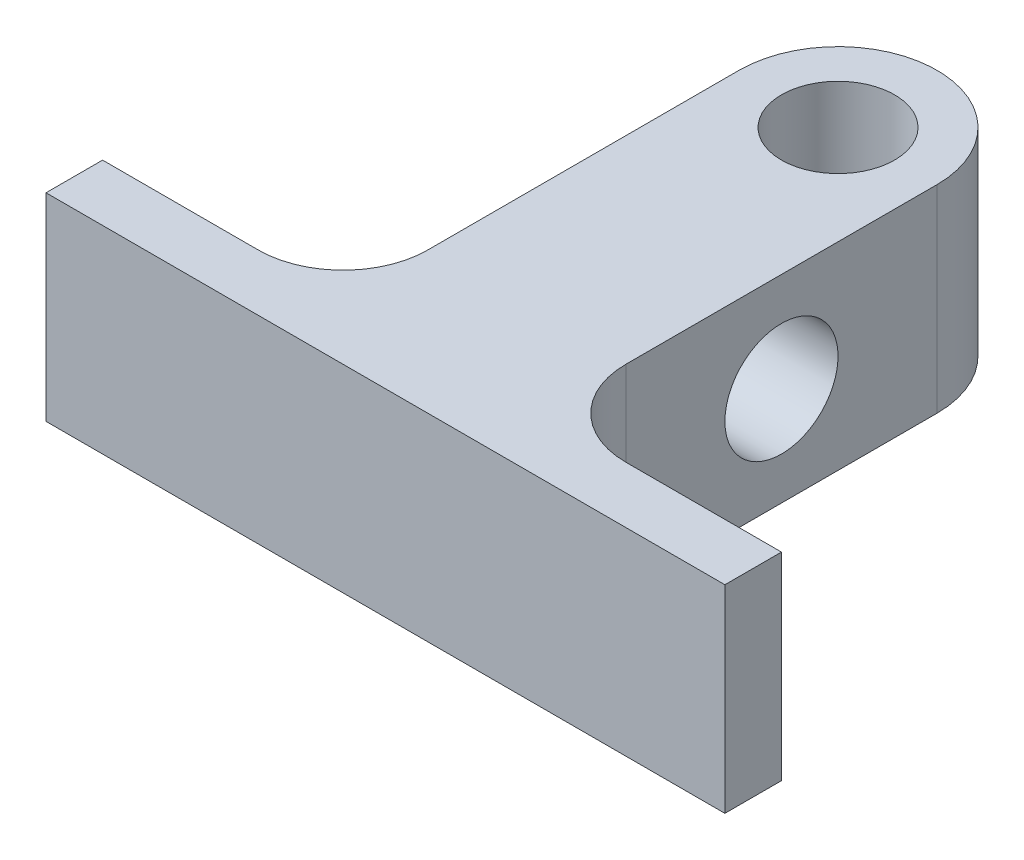
ISO-10303-21;
HEADER;
FILE_DESCRIPTION(('STEP AP214'),'2;1');
FILE_NAME('part.step','',(''),(''),'','','');
FILE_SCHEMA(('AUTOMOTIVE_DESIGN { 1 0 10303 214 1 1 1 1 }'));
ENDSEC;
DATA;
#1=APPLICATION_CONTEXT('core data for automotive mechanical design processes');
#2=APPLICATION_PROTOCOL_DEFINITION('international standard','automotive_design',2000,#1);
#3=PRODUCT_CONTEXT('',#1,'mechanical');
#4=PRODUCT('Part','Part','',(#3));
#5=PRODUCT_RELATED_PRODUCT_CATEGORY('part','',(#4));
#6=PRODUCT_DEFINITION_FORMATION('','',#4);
#7=PRODUCT_DEFINITION_CONTEXT('part definition',#1,'design');
#8=PRODUCT_DEFINITION('design','',#6,#7);
#9=PRODUCT_DEFINITION_SHAPE('','',#8);
#10=(LENGTH_UNIT() NAMED_UNIT(*) SI_UNIT(.MILLI.,.METRE.));
#11=(NAMED_UNIT(*) PLANE_ANGLE_UNIT() SI_UNIT($,.RADIAN.));
#12=(NAMED_UNIT(*) SI_UNIT($,.STERADIAN.) SOLID_ANGLE_UNIT());
#13=UNCERTAINTY_MEASURE_WITH_UNIT(LENGTH_MEASURE(1.E-05),#10,'distance_accuracy_value','');
#14=(GEOMETRIC_REPRESENTATION_CONTEXT(3) GLOBAL_UNCERTAINTY_ASSIGNED_CONTEXT((#13)) GLOBAL_UNIT_ASSIGNED_CONTEXT((#10,
#11,#12)) REPRESENTATION_CONTEXT('',''));
#15=CARTESIAN_POINT('',(0.,0.,0.));
#16=DIRECTION('',(0.,0.,1.));
#17=DIRECTION('',(1.,0.,0.));
#18=AXIS2_PLACEMENT_3D('',#15,#16,#17);
#19=CARTESIAN_POINT('',(-16.25,17.5,7.5));
#20=DIRECTION('',(0.,1.,0.));
#21=DIRECTION('',(0.,0.,1.));
#22=AXIS2_PLACEMENT_3D('',#19,#20,#21);
#23=PLANE('',#22);
#24=CARTESIAN_POINT('',(-16.25,17.5,7.5));
#25=DIRECTION('',(0.,-1.,0.));
#26=DIRECTION('',(0.,0.,1.));
#27=AXIS2_PLACEMENT_3D('',#24,#25,#26);
#28=CIRCLE('',#27,7.5);
#29=CARTESIAN_POINT('',(-8.74999999999999,17.5,7.5));
#30=VERTEX_POINT('',#29);
#31=CARTESIAN_POINT('',(-16.25,17.5,15.));
#32=VERTEX_POINT('',#31);
#33=EDGE_CURVE('E167',#30,#32,#28,.T.);
#34=ORIENTED_EDGE('',*,*,#33,.T.);
#35=DIRECTION('',(-1.,0.,0.));
#36=VECTOR('',#35,1.);
#37=CARTESIAN_POINT('',(-30.,17.5,15.));
#38=LINE('',#37,#36);
#39=CARTESIAN_POINT('',(-30.,17.5,15.));
#40=VERTEX_POINT('',#39);
#41=EDGE_CURVE('E105',#32,#40,#38,.T.);
#42=ORIENTED_EDGE('',*,*,#41,.T.);
#43=DIRECTION('',(0.,0.,1.));
#44=VECTOR('',#43,1.);
#45=CARTESIAN_POINT('',(-30.,17.5,20.));
#46=LINE('',#45,#44);
#47=CARTESIAN_POINT('',(-30.,17.5,20.));
#48=VERTEX_POINT('',#47);
#49=EDGE_CURVE('E188',#40,#48,#46,.T.);
#50=ORIENTED_EDGE('',*,*,#49,.T.);
#51=DIRECTION('',(1.,0.,0.));
#52=VECTOR('',#51,1.);
#53=CARTESIAN_POINT('',(30.,17.5,20.));
#54=LINE('',#53,#52);
#55=CARTESIAN_POINT('',(30.,17.5,20.));
#56=VERTEX_POINT('',#55);
#57=EDGE_CURVE('E207',#48,#56,#54,.T.);
#58=ORIENTED_EDGE('',*,*,#57,.T.);
#59=DIRECTION('',(0.,0.,-1.));
#60=VECTOR('',#59,1.);
#61=CARTESIAN_POINT('',(30.,17.5,15.));
#62=LINE('',#61,#60);
#63=CARTESIAN_POINT('',(30.,17.5,15.));
#64=VERTEX_POINT('',#63);
#65=EDGE_CURVE('E204',#56,#64,#62,.T.);
#66=ORIENTED_EDGE('',*,*,#65,.T.);
#67=DIRECTION('',(-1.,0.,0.));
#68=VECTOR('',#67,1.);
#69=CARTESIAN_POINT('',(16.25,17.5,15.));
#70=LINE('',#69,#68);
#71=CARTESIAN_POINT('',(16.25,17.5,15.));
#72=VERTEX_POINT('',#71);
#73=EDGE_CURVE('E206',#64,#72,#70,.T.);
#74=ORIENTED_EDGE('',*,*,#73,.T.);
#75=CARTESIAN_POINT('',(16.25,17.5,7.5));
#76=DIRECTION('',(0.,-1.,0.));
#77=DIRECTION('',(0.,0.,1.));
#78=AXIS2_PLACEMENT_3D('',#75,#76,#77);
#79=CIRCLE('',#78,7.5);
#80=CARTESIAN_POINT('',(8.74999999999999,17.5,7.5));
#81=VERTEX_POINT('',#80);
#82=EDGE_CURVE('E130',#72,#81,#79,.T.);
#83=ORIENTED_EDGE('',*,*,#82,.T.);
#84=DIRECTION('',(0.,0.,-1.));
#85=VECTOR('',#84,1.);
#86=CARTESIAN_POINT('',(8.75,17.5,-20.));
#87=LINE('',#86,#85);
#88=CARTESIAN_POINT('',(8.75,17.5,-20.));
#89=VERTEX_POINT('',#88);
#90=EDGE_CURVE('E124',#81,#89,#87,.T.);
#91=ORIENTED_EDGE('',*,*,#90,.T.);
#92=CARTESIAN_POINT('',(0.,17.5,-20.));
#93=DIRECTION('',(0.,1.,0.));
#94=DIRECTION('',(0.,0.,-1.));
#95=AXIS2_PLACEMENT_3D('',#92,#93,#94);
#96=CIRCLE('',#95,8.75);
#97=CARTESIAN_POINT('',(-8.75,17.5,-20.));
#98=VERTEX_POINT('',#97);
#99=EDGE_CURVE('E128',#89,#98,#96,.T.);
#100=ORIENTED_EDGE('',*,*,#99,.T.);
#101=DIRECTION('',(0.,0.,1.));
#102=VECTOR('',#101,1.);
#103=CARTESIAN_POINT('',(-8.74999999999999,17.5,7.5));
#104=LINE('',#103,#102);
#105=EDGE_CURVE('E56',#98,#30,#104,.T.);
#106=ORIENTED_EDGE('',*,*,#105,.T.);
#107=EDGE_LOOP('',(#34,#42,#50,#58,#66,#74,#83,#91,#100,#106));
#108=FACE_BOUND('',#107,.T.);
#109=CARTESIAN_POINT('',(0.,17.5,-20.));
#110=DIRECTION('',(0.,1.,0.));
#111=DIRECTION('',(0.,0.,1.));
#112=AXIS2_PLACEMENT_3D('',#109,#110,#111);
#113=CIRCLE('',#112,5.);
#114=CARTESIAN_POINT('',(0.,17.5,-15.));
#115=VERTEX_POINT('',#114);
#116=EDGE_CURVE('E152',#115,#115,#113,.T.);
#117=ORIENTED_EDGE('',*,*,#116,.F.);
#118=EDGE_LOOP('',(#117));
#119=FACE_BOUND('',#118,.T.);
#120=ADVANCED_FACE('F39',(#108,#119),#23,.T.);
#121=CARTESIAN_POINT('',(-16.25,0.,7.5));
#122=DIRECTION('',(0.,1.,0.));
#123=DIRECTION('',(0.,0.,1.));
#124=AXIS2_PLACEMENT_3D('',#121,#122,#123);
#125=PLANE('',#124);
#126=CARTESIAN_POINT('',(-16.25,0.,7.5));
#127=DIRECTION('',(0.,-1.,0.));
#128=DIRECTION('',(0.,0.,1.));
#129=AXIS2_PLACEMENT_3D('',#126,#127,#128);
#130=CIRCLE('',#129,7.5);
#131=CARTESIAN_POINT('',(-8.74999999999999,0.,7.5));
#132=VERTEX_POINT('',#131);
#133=CARTESIAN_POINT('',(-16.25,0.,15.));
#134=VERTEX_POINT('',#133);
#135=EDGE_CURVE('E148',#132,#134,#130,.T.);
#136=ORIENTED_EDGE('',*,*,#135,.F.);
#137=DIRECTION('',(0.,0.,1.));
#138=VECTOR('',#137,1.);
#139=CARTESIAN_POINT('',(-8.74999999999999,0.,7.5));
#140=LINE('',#139,#138);
#141=CARTESIAN_POINT('',(-8.75,0.,-20.));
#142=VERTEX_POINT('',#141);
#143=EDGE_CURVE('E97',#142,#132,#140,.T.);
#144=ORIENTED_EDGE('',*,*,#143,.F.);
#145=CARTESIAN_POINT('',(0.,0.,-20.));
#146=DIRECTION('',(0.,1.,0.));
#147=DIRECTION('',(0.,0.,-1.));
#148=AXIS2_PLACEMENT_3D('',#145,#146,#147);
#149=CIRCLE('',#148,8.75);
#150=CARTESIAN_POINT('',(8.75,0.,-20.));
#151=VERTEX_POINT('',#150);
#152=EDGE_CURVE('E91',#151,#142,#149,.T.);
#153=ORIENTED_EDGE('',*,*,#152,.F.);
#154=DIRECTION('',(0.,0.,-1.));
#155=VECTOR('',#154,1.);
#156=CARTESIAN_POINT('',(8.75,0.,-20.));
#157=LINE('',#156,#155);
#158=CARTESIAN_POINT('',(8.74999999999999,0.,7.5));
#159=VERTEX_POINT('',#158);
#160=EDGE_CURVE('E138',#159,#151,#157,.T.);
#161=ORIENTED_EDGE('',*,*,#160,.F.);
#162=CARTESIAN_POINT('',(16.25,0.,7.5));
#163=DIRECTION('',(0.,-1.,0.));
#164=DIRECTION('',(0.,0.,1.));
#165=AXIS2_PLACEMENT_3D('',#162,#163,#164);
#166=CIRCLE('',#165,7.5);
#167=CARTESIAN_POINT('',(16.25,0.,15.));
#168=VERTEX_POINT('',#167);
#169=EDGE_CURVE('E162',#168,#159,#166,.T.);
#170=ORIENTED_EDGE('',*,*,#169,.F.);
#171=DIRECTION('',(-1.,0.,0.));
#172=VECTOR('',#171,1.);
#173=CARTESIAN_POINT('',(16.25,0.,15.));
#174=LINE('',#173,#172);
#175=CARTESIAN_POINT('',(30.,0.,15.));
#176=VERTEX_POINT('',#175);
#177=EDGE_CURVE('E160',#176,#168,#174,.T.);
#178=ORIENTED_EDGE('',*,*,#177,.F.);
#179=DIRECTION('',(0.,0.,-1.));
#180=VECTOR('',#179,1.);
#181=CARTESIAN_POINT('',(30.,0.,15.));
#182=LINE('',#181,#180);
#183=CARTESIAN_POINT('',(30.,0.,20.));
#184=VERTEX_POINT('',#183);
#185=EDGE_CURVE('E158',#184,#176,#182,.T.);
#186=ORIENTED_EDGE('',*,*,#185,.F.);
#187=DIRECTION('',(1.,0.,0.));
#188=VECTOR('',#187,1.);
#189=CARTESIAN_POINT('',(30.,0.,20.));
#190=LINE('',#189,#188);
#191=CARTESIAN_POINT('',(-30.,0.,20.));
#192=VERTEX_POINT('',#191);
#193=EDGE_CURVE('E156',#192,#184,#190,.T.);
#194=ORIENTED_EDGE('',*,*,#193,.F.);
#195=DIRECTION('',(0.,0.,1.));
#196=VECTOR('',#195,1.);
#197=CARTESIAN_POINT('',(-30.,0.,20.));
#198=LINE('',#197,#196);
#199=CARTESIAN_POINT('',(-30.,0.,15.));
#200=VERTEX_POINT('',#199);
#201=EDGE_CURVE('E154',#200,#192,#198,.T.);
#202=ORIENTED_EDGE('',*,*,#201,.F.);
#203=DIRECTION('',(-1.,0.,0.));
#204=VECTOR('',#203,1.);
#205=CARTESIAN_POINT('',(-30.,0.,15.));
#206=LINE('',#205,#204);
#207=EDGE_CURVE('E151',#134,#200,#206,.T.);
#208=ORIENTED_EDGE('',*,*,#207,.F.);
#209=EDGE_LOOP('',(#136,#144,#153,#161,#170,#178,#186,#194,#202,#208));
#210=FACE_BOUND('',#209,.T.);
#211=CARTESIAN_POINT('',(0.,0.,-20.));
#212=DIRECTION('',(0.,1.,0.));
#213=DIRECTION('',(0.,0.,1.));
#214=AXIS2_PLACEMENT_3D('',#211,#212,#213);
#215=CIRCLE('',#214,5.);
#216=CARTESIAN_POINT('',(0.,0.,-15.));
#217=VERTEX_POINT('',#216);
#218=EDGE_CURVE('E215',#217,#217,#215,.T.);
#219=ORIENTED_EDGE('',*,*,#218,.T.);
#220=EDGE_LOOP('',(#219));
#221=FACE_BOUND('',#220,.T.);
#222=ADVANCED_FACE('F192',(#210,#221),#125,.F.);
#223=CARTESIAN_POINT('',(-16.25,17.5,7.5));
#224=DIRECTION('',(0.,-1.,0.));
#225=DIRECTION('',(0.,0.,-1.));
#226=AXIS2_PLACEMENT_3D('',#223,#224,#225);
#227=CYLINDRICAL_SURFACE('',#226,7.5);
#228=ORIENTED_EDGE('',*,*,#135,.T.);
#229=DIRECTION('',(0.,-1.,0.));
#230=VECTOR('',#229,1.);
#231=CARTESIAN_POINT('',(-16.25,17.5,15.));
#232=LINE('',#231,#230);
#233=EDGE_CURVE('E11',#32,#134,#232,.T.);
#234=ORIENTED_EDGE('',*,*,#233,.F.);
#235=ORIENTED_EDGE('',*,*,#33,.F.);
#236=DIRECTION('',(0.,-1.,0.));
#237=VECTOR('',#236,1.);
#238=CARTESIAN_POINT('',(-8.74999999999999,17.5,7.5));
#239=LINE('',#238,#237);
#240=EDGE_CURVE('E144',#30,#132,#239,.T.);
#241=ORIENTED_EDGE('',*,*,#240,.T.);
#242=EDGE_LOOP('',(#228,#234,#235,#241));
#243=FACE_BOUND('',#242,.T.);
#244=ADVANCED_FACE('F41',(#243),#227,.F.);
#245=CARTESIAN_POINT('',(-30.,17.5,15.));
#246=DIRECTION('',(0.,0.,1.));
#247=DIRECTION('',(1.,0.,0.));
#248=AXIS2_PLACEMENT_3D('',#245,#246,#247);
#249=PLANE('',#248);
#250=ORIENTED_EDGE('',*,*,#207,.T.);
#251=DIRECTION('',(0.,-1.,0.));
#252=VECTOR('',#251,1.);
#253=CARTESIAN_POINT('',(-30.,17.5,15.));
#254=LINE('',#253,#252);
#255=EDGE_CURVE('E48',#40,#200,#254,.T.);
#256=ORIENTED_EDGE('',*,*,#255,.F.);
#257=ORIENTED_EDGE('',*,*,#41,.F.);
#258=ORIENTED_EDGE('',*,*,#233,.T.);
#259=EDGE_LOOP('',(#250,#256,#257,#258));
#260=FACE_BOUND('',#259,.T.);
#261=ADVANCED_FACE('F322',(#260),#249,.F.);
#262=CARTESIAN_POINT('',(-30.,17.5,20.));
#263=DIRECTION('',(1.,0.,0.));
#264=DIRECTION('',(0.,0.,-1.));
#265=AXIS2_PLACEMENT_3D('',#262,#263,#264);
#266=PLANE('',#265);
#267=ORIENTED_EDGE('',*,*,#201,.T.);
#268=DIRECTION('',(0.,-1.,0.));
#269=VECTOR('',#268,1.);
#270=CARTESIAN_POINT('',(-30.,17.5,20.));
#271=LINE('',#270,#269);
#272=EDGE_CURVE('E180',#48,#192,#271,.T.);
#273=ORIENTED_EDGE('',*,*,#272,.F.);
#274=ORIENTED_EDGE('',*,*,#49,.F.);
#275=ORIENTED_EDGE('',*,*,#255,.T.);
#276=EDGE_LOOP('',(#267,#273,#274,#275));
#277=FACE_BOUND('',#276,.T.);
#278=ADVANCED_FACE('F186',(#277),#266,.F.);
#279=CARTESIAN_POINT('',(30.,17.5,20.));
#280=DIRECTION('',(0.,0.,-1.));
#281=DIRECTION('',(-1.,0.,0.));
#282=AXIS2_PLACEMENT_3D('',#279,#280,#281);
#283=PLANE('',#282);
#284=ORIENTED_EDGE('',*,*,#193,.T.);
#285=DIRECTION('',(0.,-1.,0.));
#286=VECTOR('',#285,1.);
#287=CARTESIAN_POINT('',(30.,17.5,20.));
#288=LINE('',#287,#286);
#289=EDGE_CURVE('E177',#56,#184,#288,.T.);
#290=ORIENTED_EDGE('',*,*,#289,.F.);
#291=ORIENTED_EDGE('',*,*,#57,.F.);
#292=ORIENTED_EDGE('',*,*,#272,.T.);
#293=EDGE_LOOP('',(#284,#290,#291,#292));
#294=FACE_BOUND('',#293,.T.);
#295=ADVANCED_FACE('F198',(#294),#283,.F.);
#296=CARTESIAN_POINT('',(30.,17.5,15.));
#297=DIRECTION('',(-1.,0.,0.));
#298=DIRECTION('',(0.,0.,1.));
#299=AXIS2_PLACEMENT_3D('',#296,#297,#298);
#300=PLANE('',#299);
#301=ORIENTED_EDGE('',*,*,#185,.T.);
#302=DIRECTION('',(0.,-1.,0.));
#303=VECTOR('',#302,1.);
#304=CARTESIAN_POINT('',(30.,17.5,15.));
#305=LINE('',#304,#303);
#306=EDGE_CURVE('E174',#64,#176,#305,.T.);
#307=ORIENTED_EDGE('',*,*,#306,.F.);
#308=ORIENTED_EDGE('',*,*,#65,.F.);
#309=ORIENTED_EDGE('',*,*,#289,.T.);
#310=EDGE_LOOP('',(#301,#307,#308,#309));
#311=FACE_BOUND('',#310,.T.);
#312=ADVANCED_FACE('F202',(#311),#300,.F.);
#313=CARTESIAN_POINT('',(16.25,17.5,15.));
#314=DIRECTION('',(0.,0.,1.));
#315=DIRECTION('',(1.,0.,0.));
#316=AXIS2_PLACEMENT_3D('',#313,#314,#315);
#317=PLANE('',#316);
#318=ORIENTED_EDGE('',*,*,#177,.T.);
#319=DIRECTION('',(0.,-1.,0.));
#320=VECTOR('',#319,1.);
#321=CARTESIAN_POINT('',(16.25,17.5,15.));
#322=LINE('',#321,#320);
#323=EDGE_CURVE('E171',#72,#168,#322,.T.);
#324=ORIENTED_EDGE('',*,*,#323,.F.);
#325=ORIENTED_EDGE('',*,*,#73,.F.);
#326=ORIENTED_EDGE('',*,*,#306,.T.);
#327=EDGE_LOOP('',(#318,#324,#325,#326));
#328=FACE_BOUND('',#327,.T.);
#329=ADVANCED_FACE('F287',(#328),#317,.F.);
#330=CARTESIAN_POINT('',(16.25,17.5,7.5));
#331=DIRECTION('',(0.,-1.,0.));
#332=DIRECTION('',(0.,0.,-1.));
#333=AXIS2_PLACEMENT_3D('',#330,#331,#332);
#334=CYLINDRICAL_SURFACE('',#333,7.5);
#335=ORIENTED_EDGE('',*,*,#169,.T.);
#336=DIRECTION('',(0.,-1.,0.));
#337=VECTOR('',#336,1.);
#338=CARTESIAN_POINT('',(8.74999999999999,17.5,7.5));
#339=LINE('',#338,#337);
#340=EDGE_CURVE('E139',#81,#159,#339,.T.);
#341=ORIENTED_EDGE('',*,*,#340,.F.);
#342=ORIENTED_EDGE('',*,*,#82,.F.);
#343=ORIENTED_EDGE('',*,*,#323,.T.);
#344=EDGE_LOOP('',(#335,#341,#342,#343));
#345=FACE_BOUND('',#344,.T.);
#346=ADVANCED_FACE('F278',(#345),#334,.F.);
#347=CARTESIAN_POINT('',(8.75,17.5,-20.));
#348=DIRECTION('',(-1.,0.,0.));
#349=DIRECTION('',(0.,0.,1.));
#350=AXIS2_PLACEMENT_3D('',#347,#348,#349);
#351=PLANE('',#350);
#352=CARTESIAN_POINT('',(8.75,8.75,-6.25));
#353=DIRECTION('',(-1.,0.,0.));
#354=DIRECTION('',(0.,0.,1.));
#355=AXIS2_PLACEMENT_3D('',#352,#353,#354);
#356=CIRCLE('',#355,5.);
#357=CARTESIAN_POINT('',(8.75,8.75,-1.25));
#358=VERTEX_POINT('',#357);
#359=EDGE_CURVE('E218',#358,#358,#356,.T.);
#360=ORIENTED_EDGE('',*,*,#359,.T.);
#361=EDGE_LOOP('',(#360));
#362=FACE_BOUND('',#361,.T.);
#363=ORIENTED_EDGE('',*,*,#160,.T.);
#364=DIRECTION('',(0.,-1.,0.));
#365=VECTOR('',#364,1.);
#366=CARTESIAN_POINT('',(8.75,17.5,-20.));
#367=LINE('',#366,#365);
#368=EDGE_CURVE('E135',#89,#151,#367,.T.);
#369=ORIENTED_EDGE('',*,*,#368,.F.);
#370=ORIENTED_EDGE('',*,*,#90,.F.);
#371=ORIENTED_EDGE('',*,*,#340,.T.);
#372=EDGE_LOOP('',(#363,#369,#370,#371));
#373=FACE_BOUND('',#372,.T.);
#374=ADVANCED_FACE('F136',(#362,#373),#351,.F.);
#375=CARTESIAN_POINT('',(0.,17.5,-20.));
#376=DIRECTION('',(0.,-1.,0.));
#377=DIRECTION('',(0.,0.,-1.));
#378=AXIS2_PLACEMENT_3D('',#375,#376,#377);
#379=CYLINDRICAL_SURFACE('',#378,8.75);
#380=ORIENTED_EDGE('',*,*,#152,.T.);
#381=DIRECTION('',(0.,-1.,0.));
#382=VECTOR('',#381,1.);
#383=CARTESIAN_POINT('',(-8.75,17.5,-20.));
#384=LINE('',#383,#382);
#385=EDGE_CURVE('E140',#98,#142,#384,.T.);
#386=ORIENTED_EDGE('',*,*,#385,.F.);
#387=ORIENTED_EDGE('',*,*,#99,.F.);
#388=ORIENTED_EDGE('',*,*,#368,.T.);
#389=EDGE_LOOP('',(#380,#386,#387,#388));
#390=FACE_BOUND('',#389,.T.);
#391=ADVANCED_FACE('F142',(#390),#379,.T.);
#392=CARTESIAN_POINT('',(-8.74999999999999,17.5,7.5));
#393=DIRECTION('',(1.,0.,0.));
#394=DIRECTION('',(0.,0.,-1.));
#395=AXIS2_PLACEMENT_3D('',#392,#393,#394);
#396=PLANE('',#395);
#397=CARTESIAN_POINT('',(-8.75,8.75,-6.25));
#398=DIRECTION('',(-1.,0.,0.));
#399=DIRECTION('',(0.,0.,1.));
#400=AXIS2_PLACEMENT_3D('',#397,#398,#399);
#401=CIRCLE('',#400,5.);
#402=CARTESIAN_POINT('',(-8.75,8.75,-1.24999999999999));
#403=VERTEX_POINT('',#402);
#404=EDGE_CURVE('E223',#403,#403,#401,.T.);
#405=ORIENTED_EDGE('',*,*,#404,.F.);
#406=EDGE_LOOP('',(#405));
#407=FACE_BOUND('',#406,.T.);
#408=ORIENTED_EDGE('',*,*,#143,.T.);
#409=ORIENTED_EDGE('',*,*,#240,.F.);
#410=ORIENTED_EDGE('',*,*,#105,.F.);
#411=ORIENTED_EDGE('',*,*,#385,.T.);
#412=EDGE_LOOP('',(#408,#409,#410,#411));
#413=FACE_BOUND('',#412,.T.);
#414=ADVANCED_FACE('F230',(#407,#413),#396,.F.);
#415=CARTESIAN_POINT('',(0.,17.5,-20.));
#416=DIRECTION('',(0.,-1.,0.));
#417=DIRECTION('',(0.,0.,-1.));
#418=AXIS2_PLACEMENT_3D('',#415,#416,#417);
#419=CYLINDRICAL_SURFACE('',#418,5.);
#420=ORIENTED_EDGE('',*,*,#116,.T.);
#421=EDGE_LOOP('',(#420));
#422=FACE_BOUND('',#421,.T.);
#423=ORIENTED_EDGE('',*,*,#218,.F.);
#424=EDGE_LOOP('',(#423));
#425=FACE_BOUND('',#424,.T.);
#426=ADVANCED_FACE('F232',(#422,#425),#419,.F.);
#427=CARTESIAN_POINT('',(30.,8.75,-6.25));
#428=DIRECTION('',(-1.,0.,0.));
#429=DIRECTION('',(0.,0.,1.));
#430=AXIS2_PLACEMENT_3D('',#427,#428,#429);
#431=CYLINDRICAL_SURFACE('',#430,5.);
#432=ORIENTED_EDGE('',*,*,#404,.T.);
#433=EDGE_LOOP('',(#432));
#434=FACE_BOUND('',#433,.T.);
#435=ORIENTED_EDGE('',*,*,#359,.F.);
#436=EDGE_LOOP('',(#435));
#437=FACE_BOUND('',#436,.T.);
#438=ADVANCED_FACE('F227',(#434,#437),#431,.F.);
#439=CLOSED_SHELL('',(#120,#222,#244,#261,#278,#295,#312,#329,#346,#374,#391,#414,#426,#438));
#440=MANIFOLD_SOLID_BREP('B2',#439);
#441=ADVANCED_BREP_SHAPE_REPRESENTATION('',(#18,#440),#14);
#442=SHAPE_DEFINITION_REPRESENTATION(#9,#441);
ENDSEC;
END-ISO-10303-21;
